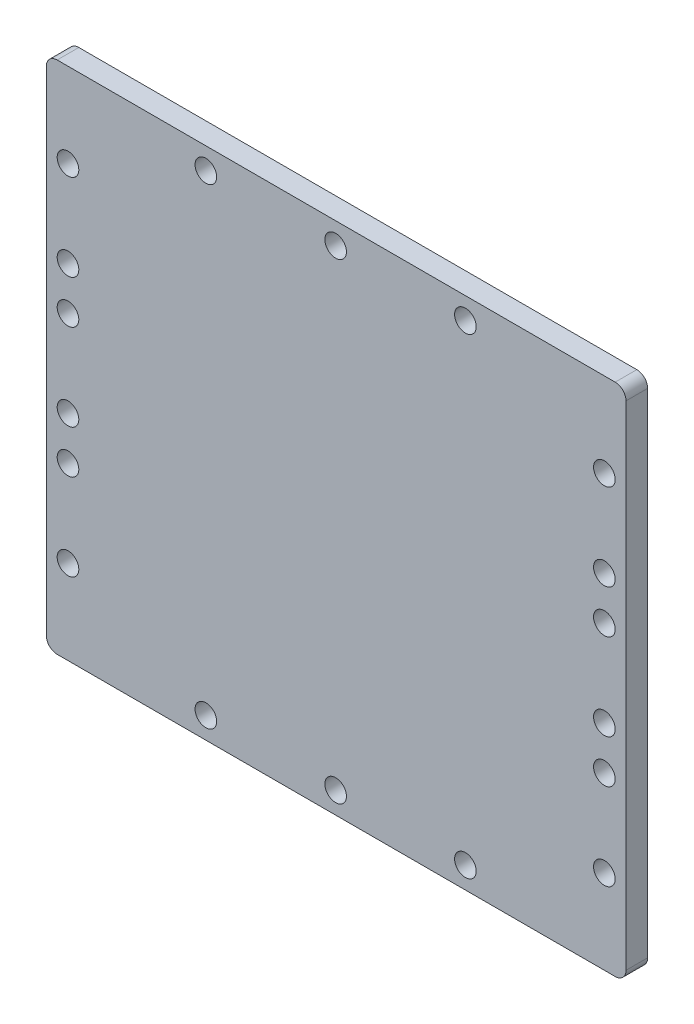
ISO-10303-21;
HEADER;
FILE_DESCRIPTION(('STEP AP214'),'2;1');
FILE_NAME('part.step','',(''),(''),'','','');
FILE_SCHEMA(('AUTOMOTIVE_DESIGN { 1 0 10303 214 1 1 1 1 }'));
ENDSEC;
DATA;
#1=APPLICATION_CONTEXT('core data for automotive mechanical design processes');
#2=APPLICATION_PROTOCOL_DEFINITION('international standard','automotive_design',2000,#1);
#3=PRODUCT_CONTEXT('',#1,'mechanical');
#4=PRODUCT('Part','Part','',(#3));
#5=PRODUCT_RELATED_PRODUCT_CATEGORY('part','',(#4));
#6=PRODUCT_DEFINITION_FORMATION('','',#4);
#7=PRODUCT_DEFINITION_CONTEXT('part definition',#1,'design');
#8=PRODUCT_DEFINITION('design','',#6,#7);
#9=PRODUCT_DEFINITION_SHAPE('','',#8);
#10=(LENGTH_UNIT() NAMED_UNIT(*) SI_UNIT(.MILLI.,.METRE.));
#11=(NAMED_UNIT(*) PLANE_ANGLE_UNIT() SI_UNIT($,.RADIAN.));
#12=(NAMED_UNIT(*) SI_UNIT($,.STERADIAN.) SOLID_ANGLE_UNIT());
#13=UNCERTAINTY_MEASURE_WITH_UNIT(LENGTH_MEASURE(1.E-05),#10,'distance_accuracy_value','');
#14=(GEOMETRIC_REPRESENTATION_CONTEXT(3) GLOBAL_UNCERTAINTY_ASSIGNED_CONTEXT((#13)) GLOBAL_UNIT_ASSIGNED_CONTEXT((#10,
#11,#12)) REPRESENTATION_CONTEXT('',''));
#15=CARTESIAN_POINT('',(0.,0.,0.));
#16=DIRECTION('',(0.,0.,1.));
#17=DIRECTION('',(1.,0.,0.));
#18=AXIS2_PLACEMENT_3D('',#15,#16,#17);
#19=CARTESIAN_POINT('',(-35.2004898971419,-25.775,2.));
#20=DIRECTION('',(0.,0.,1.));
#21=DIRECTION('',(1.,0.,0.));
#22=AXIS2_PLACEMENT_3D('',#19,#20,#21);
#23=PLANE('',#22);
#24=CARTESIAN_POINT('',(-21.4504898971419,-24.775,2.));
#25=DIRECTION('',(0.,0.,1.));
#26=DIRECTION('',(1.,0.,0.));
#27=AXIS2_PLACEMENT_3D('',#24,#25,#26);
#28=CIRCLE('',#27,1.);
#29=CARTESIAN_POINT('',(-20.4504898971419,-24.775,2.));
#30=VERTEX_POINT('',#29);
#31=EDGE_CURVE('E271',#30,#30,#28,.T.);
#32=ORIENTED_EDGE('',*,*,#31,.F.);
#33=EDGE_LOOP('',(#32));
#34=FACE_BOUND('',#33,.T.);
#35=CARTESIAN_POINT('',(-21.4504898971419,18.825,2.));
#36=DIRECTION('',(0.,0.,1.));
#37=DIRECTION('',(1.,0.,0.));
#38=AXIS2_PLACEMENT_3D('',#35,#36,#37);
#39=CIRCLE('',#38,1.);
#40=CARTESIAN_POINT('',(-20.4504898971419,18.825,2.));
#41=VERTEX_POINT('',#40);
#42=EDGE_CURVE('E259',#41,#41,#39,.T.);
#43=ORIENTED_EDGE('',*,*,#42,.F.);
#44=EDGE_LOOP('',(#43));
#45=FACE_BOUND('',#44,.T.);
#46=CARTESIAN_POINT('',(15.3995101028581,-10.975,2.));
#47=DIRECTION('',(0.,0.,1.));
#48=DIRECTION('',(1.,0.,0.));
#49=AXIS2_PLACEMENT_3D('',#46,#47,#48);
#50=CIRCLE('',#49,1.);
#51=CARTESIAN_POINT('',(16.3995101028581,-10.975,2.));
#52=VERTEX_POINT('',#51);
#53=EDGE_CURVE('E247',#52,#52,#50,.T.);
#54=ORIENTED_EDGE('',*,*,#53,.F.);
#55=EDGE_LOOP('',(#54));
#56=FACE_BOUND('',#55,.T.);
#57=CARTESIAN_POINT('',(15.3995101028581,13.025,2.));
#58=DIRECTION('',(0.,0.,1.));
#59=DIRECTION('',(1.,0.,0.));
#60=AXIS2_PLACEMENT_3D('',#57,#58,#59);
#61=CIRCLE('',#60,1.);
#62=CARTESIAN_POINT('',(16.3995101028581,13.025,2.));
#63=VERTEX_POINT('',#62);
#64=EDGE_CURVE('E235',#63,#63,#61,.T.);
#65=ORIENTED_EDGE('',*,*,#64,.F.);
#66=EDGE_LOOP('',(#65));
#67=FACE_BOUND('',#66,.T.);
#68=CARTESIAN_POINT('',(-34.2004898971419,-10.975,2.));
#69=DIRECTION('',(0.,0.,1.));
#70=DIRECTION('',(1.,0.,0.));
#71=AXIS2_PLACEMENT_3D('',#68,#69,#70);
#72=CIRCLE('',#71,0.999999999999998);
#73=CARTESIAN_POINT('',(-33.2004898971419,-10.975,2.));
#74=VERTEX_POINT('',#73);
#75=EDGE_CURVE('E223',#74,#74,#72,.T.);
#76=ORIENTED_EDGE('',*,*,#75,.F.);
#77=EDGE_LOOP('',(#76));
#78=FACE_BOUND('',#77,.T.);
#79=CARTESIAN_POINT('',(15.3995101028581,-6.97499999999999,2.));
#80=DIRECTION('',(0.,0.,1.));
#81=DIRECTION('',(1.,0.,0.));
#82=AXIS2_PLACEMENT_3D('',#79,#80,#81);
#83=CIRCLE('',#82,1.);
#84=CARTESIAN_POINT('',(16.3995101028581,-6.97499999999999,2.));
#85=VERTEX_POINT('',#84);
#86=EDGE_CURVE('E211',#85,#85,#83,.T.);
#87=ORIENTED_EDGE('',*,*,#86,.F.);
#88=EDGE_LOOP('',(#87));
#89=FACE_BOUND('',#88,.T.);
#90=CARTESIAN_POINT('',(-34.2004898971419,1.02500000000001,2.));
#91=DIRECTION('',(0.,0.,1.));
#92=DIRECTION('',(1.,0.,0.));
#93=AXIS2_PLACEMENT_3D('',#90,#91,#92);
#94=CIRCLE('',#93,0.999999999999998);
#95=CARTESIAN_POINT('',(-33.2004898971419,1.02500000000001,2.));
#96=VERTEX_POINT('',#95);
#97=EDGE_CURVE('E199',#96,#96,#94,.T.);
#98=ORIENTED_EDGE('',*,*,#97,.F.);
#99=EDGE_LOOP('',(#98));
#100=FACE_BOUND('',#99,.T.);
#101=CARTESIAN_POINT('',(-34.2004898971419,13.025,2.));
#102=DIRECTION('',(0.,0.,1.));
#103=DIRECTION('',(1.,0.,0.));
#104=AXIS2_PLACEMENT_3D('',#101,#102,#103);
#105=CIRCLE('',#104,0.999999999999998);
#106=CARTESIAN_POINT('',(-33.2004898971419,13.025,2.));
#107=VERTEX_POINT('',#106);
#108=EDGE_CURVE('E187',#107,#107,#105,.T.);
#109=ORIENTED_EDGE('',*,*,#108,.F.);
#110=EDGE_LOOP('',(#109));
#111=FACE_BOUND('',#110,.T.);
#112=CARTESIAN_POINT('',(-9.4504898971419,18.825,2.));
#113=DIRECTION('',(0.,0.,1.));
#114=DIRECTION('',(1.,0.,0.));
#115=AXIS2_PLACEMENT_3D('',#112,#113,#114);
#116=CIRCLE('',#115,1.);
#117=CARTESIAN_POINT('',(-8.4504898971419,18.825,2.));
#118=VERTEX_POINT('',#117);
#119=EDGE_CURVE('E133',#118,#118,#116,.T.);
#120=ORIENTED_EDGE('',*,*,#119,.F.);
#121=EDGE_LOOP('',(#120));
#122=FACE_BOUND('',#121,.T.);
#123=CARTESIAN_POINT('',(-35.2004898971419,-25.775,2.));
#124=DIRECTION('',(0.,0.,1.));
#125=DIRECTION('',(1.,0.,0.));
#126=AXIS2_PLACEMENT_3D('',#123,#124,#125);
#127=CIRCLE('',#126,1.);
#128=CARTESIAN_POINT('',(-36.2004898971419,-25.775,2.));
#129=VERTEX_POINT('',#128);
#130=CARTESIAN_POINT('',(-35.2004898971419,-26.775,2.));
#131=VERTEX_POINT('',#130);
#132=EDGE_CURVE('E144',#129,#131,#127,.T.);
#133=ORIENTED_EDGE('',*,*,#132,.T.);
#134=DIRECTION('',(1.,0.,0.));
#135=VECTOR('',#134,1.);
#136=CARTESIAN_POINT('',(-35.2004898971419,-26.775,2.));
#137=LINE('',#136,#135);
#138=CARTESIAN_POINT('',(16.3995101028581,-26.775,2.));
#139=VERTEX_POINT('',#138);
#140=EDGE_CURVE('E92',#131,#139,#137,.T.);
#141=ORIENTED_EDGE('',*,*,#140,.T.);
#142=CARTESIAN_POINT('',(16.3995101028581,-25.775,2.));
#143=DIRECTION('',(0.,0.,1.));
#144=DIRECTION('',(1.,0.,0.));
#145=AXIS2_PLACEMENT_3D('',#142,#143,#144);
#146=CIRCLE('',#145,1.);
#147=CARTESIAN_POINT('',(17.3995101028581,-25.775,2.));
#148=VERTEX_POINT('',#147);
#149=EDGE_CURVE('E159',#139,#148,#146,.T.);
#150=ORIENTED_EDGE('',*,*,#149,.T.);
#151=DIRECTION('',(0.,1.,0.));
#152=VECTOR('',#151,1.);
#153=CARTESIAN_POINT('',(17.3995101028581,19.825,2.));
#154=LINE('',#153,#152);
#155=CARTESIAN_POINT('',(17.3995101028581,19.825,2.));
#156=VERTEX_POINT('',#155);
#157=EDGE_CURVE('E172',#148,#156,#154,.T.);
#158=ORIENTED_EDGE('',*,*,#157,.T.);
#159=CARTESIAN_POINT('',(16.3995101028581,19.825,2.));
#160=DIRECTION('',(0.,0.,1.));
#161=DIRECTION('',(-1.,0.,0.));
#162=AXIS2_PLACEMENT_3D('',#159,#160,#161);
#163=CIRCLE('',#162,1.);
#164=CARTESIAN_POINT('',(16.3995101028581,20.825,2.));
#165=VERTEX_POINT('',#164);
#166=EDGE_CURVE('E111',#156,#165,#163,.T.);
#167=ORIENTED_EDGE('',*,*,#166,.T.);
#168=DIRECTION('',(-1.,0.,0.));
#169=VECTOR('',#168,1.);
#170=CARTESIAN_POINT('',(-35.2004898971419,20.825,2.));
#171=LINE('',#170,#169);
#172=CARTESIAN_POINT('',(-35.2004898971419,20.825,2.));
#173=VERTEX_POINT('',#172);
#174=EDGE_CURVE('E105',#165,#173,#171,.T.);
#175=ORIENTED_EDGE('',*,*,#174,.T.);
#176=CARTESIAN_POINT('',(-35.2004898971419,19.825,2.));
#177=DIRECTION('',(0.,0.,1.));
#178=DIRECTION('',(1.,0.,0.));
#179=AXIS2_PLACEMENT_3D('',#176,#177,#178);
#180=CIRCLE('',#179,1.);
#181=CARTESIAN_POINT('',(-36.2004898971419,19.825,2.));
#182=VERTEX_POINT('',#181);
#183=EDGE_CURVE('E109',#173,#182,#180,.T.);
#184=ORIENTED_EDGE('',*,*,#183,.T.);
#185=DIRECTION('',(0.,-1.,0.));
#186=VECTOR('',#185,1.);
#187=CARTESIAN_POINT('',(-36.2004898971419,19.825,2.));
#188=LINE('',#187,#186);
#189=EDGE_CURVE('E49',#182,#129,#188,.T.);
#190=ORIENTED_EDGE('',*,*,#189,.T.);
#191=EDGE_LOOP('',(#133,#141,#150,#158,#167,#175,#184,#190));
#192=FACE_BOUND('',#191,.T.);
#193=CARTESIAN_POINT('',(-9.4504898971419,-24.775,2.));
#194=DIRECTION('',(0.,0.,1.));
#195=DIRECTION('',(1.,0.,0.));
#196=AXIS2_PLACEMENT_3D('',#193,#194,#195);
#197=CIRCLE('',#196,1.);
#198=CARTESIAN_POINT('',(-8.4504898971419,-24.775,2.));
#199=VERTEX_POINT('',#198);
#200=EDGE_CURVE('E181',#199,#199,#197,.T.);
#201=ORIENTED_EDGE('',*,*,#200,.F.);
#202=EDGE_LOOP('',(#201));
#203=FACE_BOUND('',#202,.T.);
#204=CARTESIAN_POINT('',(15.3995101028581,1.02500000000001,2.));
#205=DIRECTION('',(0.,0.,1.));
#206=DIRECTION('',(1.,0.,0.));
#207=AXIS2_PLACEMENT_3D('',#204,#205,#206);
#208=CIRCLE('',#207,1.);
#209=CARTESIAN_POINT('',(16.3995101028581,1.02500000000001,2.));
#210=VERTEX_POINT('',#209);
#211=EDGE_CURVE('E193',#210,#210,#208,.T.);
#212=ORIENTED_EDGE('',*,*,#211,.F.);
#213=EDGE_LOOP('',(#212));
#214=FACE_BOUND('',#213,.T.);
#215=CARTESIAN_POINT('',(-34.2004898971419,-6.97499999999999,2.));
#216=DIRECTION('',(0.,0.,1.));
#217=DIRECTION('',(1.,0.,0.));
#218=AXIS2_PLACEMENT_3D('',#215,#216,#217);
#219=CIRCLE('',#218,0.999999999999998);
#220=CARTESIAN_POINT('',(-33.2004898971419,-6.97499999999999,2.));
#221=VERTEX_POINT('',#220);
#222=EDGE_CURVE('E205',#221,#221,#219,.T.);
#223=ORIENTED_EDGE('',*,*,#222,.F.);
#224=EDGE_LOOP('',(#223));
#225=FACE_BOUND('',#224,.T.);
#226=CARTESIAN_POINT('',(-34.2004898971419,5.02500000000001,2.));
#227=DIRECTION('',(0.,0.,1.));
#228=DIRECTION('',(1.,0.,0.));
#229=AXIS2_PLACEMENT_3D('',#226,#227,#228);
#230=CIRCLE('',#229,0.999999999999998);
#231=CARTESIAN_POINT('',(-33.2004898971419,5.02500000000001,2.));
#232=VERTEX_POINT('',#231);
#233=EDGE_CURVE('E217',#232,#232,#230,.T.);
#234=ORIENTED_EDGE('',*,*,#233,.F.);
#235=EDGE_LOOP('',(#234));
#236=FACE_BOUND('',#235,.T.);
#237=CARTESIAN_POINT('',(-34.2004898971419,-18.975,2.));
#238=DIRECTION('',(0.,0.,1.));
#239=DIRECTION('',(1.,0.,0.));
#240=AXIS2_PLACEMENT_3D('',#237,#238,#239);
#241=CIRCLE('',#240,0.999999999999998);
#242=CARTESIAN_POINT('',(-33.2004898971419,-18.975,2.));
#243=VERTEX_POINT('',#242);
#244=EDGE_CURVE('E229',#243,#243,#241,.T.);
#245=ORIENTED_EDGE('',*,*,#244,.F.);
#246=EDGE_LOOP('',(#245));
#247=FACE_BOUND('',#246,.T.);
#248=CARTESIAN_POINT('',(15.3995101028581,5.02500000000001,2.));
#249=DIRECTION('',(0.,0.,1.));
#250=DIRECTION('',(1.,0.,0.));
#251=AXIS2_PLACEMENT_3D('',#248,#249,#250);
#252=CIRCLE('',#251,1.00000000000001);
#253=CARTESIAN_POINT('',(16.3995101028581,5.02500000000001,2.));
#254=VERTEX_POINT('',#253);
#255=EDGE_CURVE('E241',#254,#254,#252,.T.);
#256=ORIENTED_EDGE('',*,*,#255,.F.);
#257=EDGE_LOOP('',(#256));
#258=FACE_BOUND('',#257,.T.);
#259=CARTESIAN_POINT('',(15.3995101028581,-18.975,2.));
#260=DIRECTION('',(0.,0.,1.));
#261=DIRECTION('',(1.,0.,0.));
#262=AXIS2_PLACEMENT_3D('',#259,#260,#261);
#263=CIRCLE('',#262,1.);
#264=CARTESIAN_POINT('',(16.3995101028581,-18.975,2.));
#265=VERTEX_POINT('',#264);
#266=EDGE_CURVE('E253',#265,#265,#263,.T.);
#267=ORIENTED_EDGE('',*,*,#266,.F.);
#268=EDGE_LOOP('',(#267));
#269=FACE_BOUND('',#268,.T.);
#270=CARTESIAN_POINT('',(2.5495101028581,18.825,2.));
#271=DIRECTION('',(0.,0.,1.));
#272=DIRECTION('',(1.,0.,0.));
#273=AXIS2_PLACEMENT_3D('',#270,#271,#272);
#274=CIRCLE('',#273,1.);
#275=CARTESIAN_POINT('',(3.5495101028581,18.825,2.));
#276=VERTEX_POINT('',#275);
#277=EDGE_CURVE('E265',#276,#276,#274,.T.);
#278=ORIENTED_EDGE('',*,*,#277,.F.);
#279=EDGE_LOOP('',(#278));
#280=FACE_BOUND('',#279,.T.);
#281=CARTESIAN_POINT('',(2.54951010285809,-24.775,2.));
#282=DIRECTION('',(0.,0.,1.));
#283=DIRECTION('',(1.,0.,0.));
#284=AXIS2_PLACEMENT_3D('',#281,#282,#283);
#285=CIRCLE('',#284,1.);
#286=CARTESIAN_POINT('',(3.5495101028581,-24.775,2.));
#287=VERTEX_POINT('',#286);
#288=EDGE_CURVE('E277',#287,#287,#285,.T.);
#289=ORIENTED_EDGE('',*,*,#288,.F.);
#290=EDGE_LOOP('',(#289));
#291=FACE_BOUND('',#290,.T.);
#292=ADVANCED_FACE('F32',(#34,#45,#56,#67,#78,#89,#100,#111,#122,#192,#203,#214,#225,#236,#247,
#258,#269,#280,#291),#23,.T.);
#293=CARTESIAN_POINT('',(-35.2004898971419,-25.775,0.));
#294=DIRECTION('',(0.,0.,1.));
#295=DIRECTION('',(1.,0.,0.));
#296=AXIS2_PLACEMENT_3D('',#293,#294,#295);
#297=PLANE('',#296);
#298=CARTESIAN_POINT('',(-35.2004898971419,-25.775,0.));
#299=DIRECTION('',(0.,0.,1.));
#300=DIRECTION('',(1.,0.,0.));
#301=AXIS2_PLACEMENT_3D('',#298,#299,#300);
#302=CIRCLE('',#301,1.);
#303=CARTESIAN_POINT('',(-36.2004898971419,-25.775,0.));
#304=VERTEX_POINT('',#303);
#305=CARTESIAN_POINT('',(-35.2004898971419,-26.775,0.));
#306=VERTEX_POINT('',#305);
#307=EDGE_CURVE('E129',#304,#306,#302,.T.);
#308=ORIENTED_EDGE('',*,*,#307,.F.);
#309=DIRECTION('',(0.,-1.,0.));
#310=VECTOR('',#309,1.);
#311=CARTESIAN_POINT('',(-36.2004898971419,19.825,0.));
#312=LINE('',#311,#310);
#313=CARTESIAN_POINT('',(-36.2004898971419,19.825,0.));
#314=VERTEX_POINT('',#313);
#315=EDGE_CURVE('E84',#314,#304,#312,.T.);
#316=ORIENTED_EDGE('',*,*,#315,.F.);
#317=CARTESIAN_POINT('',(-35.2004898971419,19.825,0.));
#318=DIRECTION('',(0.,0.,1.));
#319=DIRECTION('',(1.,0.,0.));
#320=AXIS2_PLACEMENT_3D('',#317,#318,#319);
#321=CIRCLE('',#320,1.);
#322=CARTESIAN_POINT('',(-35.2004898971419,20.825,0.));
#323=VERTEX_POINT('',#322);
#324=EDGE_CURVE('E78',#323,#314,#321,.T.);
#325=ORIENTED_EDGE('',*,*,#324,.F.);
#326=DIRECTION('',(-1.,0.,0.));
#327=VECTOR('',#326,1.);
#328=CARTESIAN_POINT('',(-35.2004898971419,20.825,0.));
#329=LINE('',#328,#327);
#330=CARTESIAN_POINT('',(16.3995101028581,20.825,0.));
#331=VERTEX_POINT('',#330);
#332=EDGE_CURVE('E119',#331,#323,#329,.T.);
#333=ORIENTED_EDGE('',*,*,#332,.F.);
#334=CARTESIAN_POINT('',(16.3995101028581,19.825,0.));
#335=DIRECTION('',(0.,0.,1.));
#336=DIRECTION('',(-1.,0.,0.));
#337=AXIS2_PLACEMENT_3D('',#334,#335,#336);
#338=CIRCLE('',#337,1.);
#339=CARTESIAN_POINT('',(17.3995101028581,19.825,0.));
#340=VERTEX_POINT('',#339);
#341=EDGE_CURVE('E139',#340,#331,#338,.T.);
#342=ORIENTED_EDGE('',*,*,#341,.F.);
#343=DIRECTION('',(0.,1.,0.));
#344=VECTOR('',#343,1.);
#345=CARTESIAN_POINT('',(17.3995101028581,19.825,0.));
#346=LINE('',#345,#344);
#347=CARTESIAN_POINT('',(17.3995101028581,-25.775,0.));
#348=VERTEX_POINT('',#347);
#349=EDGE_CURVE('E137',#348,#340,#346,.T.);
#350=ORIENTED_EDGE('',*,*,#349,.F.);
#351=CARTESIAN_POINT('',(16.3995101028581,-25.775,0.));
#352=DIRECTION('',(0.,0.,1.));
#353=DIRECTION('',(1.,0.,0.));
#354=AXIS2_PLACEMENT_3D('',#351,#352,#353);
#355=CIRCLE('',#354,1.);
#356=CARTESIAN_POINT('',(16.3995101028581,-26.775,0.));
#357=VERTEX_POINT('',#356);
#358=EDGE_CURVE('E135',#357,#348,#355,.T.);
#359=ORIENTED_EDGE('',*,*,#358,.F.);
#360=DIRECTION('',(1.,0.,0.));
#361=VECTOR('',#360,1.);
#362=CARTESIAN_POINT('',(-35.2004898971419,-26.775,0.));
#363=LINE('',#362,#361);
#364=EDGE_CURVE('E132',#306,#357,#363,.T.);
#365=ORIENTED_EDGE('',*,*,#364,.F.);
#366=EDGE_LOOP('',(#308,#316,#325,#333,#342,#350,#359,#365));
#367=FACE_BOUND('',#366,.T.);
#368=CARTESIAN_POINT('',(-9.4504898971419,18.825,0.));
#369=DIRECTION('',(0.,0.,1.));
#370=DIRECTION('',(1.,0.,0.));
#371=AXIS2_PLACEMENT_3D('',#368,#369,#370);
#372=CIRCLE('',#371,1.);
#373=CARTESIAN_POINT('',(-8.4504898971419,18.825,0.));
#374=VERTEX_POINT('',#373);
#375=EDGE_CURVE('E178',#374,#374,#372,.T.);
#376=ORIENTED_EDGE('',*,*,#375,.T.);
#377=EDGE_LOOP('',(#376));
#378=FACE_BOUND('',#377,.T.);
#379=CARTESIAN_POINT('',(-9.4504898971419,-24.775,0.));
#380=DIRECTION('',(0.,0.,1.));
#381=DIRECTION('',(1.,0.,0.));
#382=AXIS2_PLACEMENT_3D('',#379,#380,#381);
#383=CIRCLE('',#382,1.);
#384=CARTESIAN_POINT('',(-8.4504898971419,-24.775,0.));
#385=VERTEX_POINT('',#384);
#386=EDGE_CURVE('E184',#385,#385,#383,.T.);
#387=ORIENTED_EDGE('',*,*,#386,.T.);
#388=EDGE_LOOP('',(#387));
#389=FACE_BOUND('',#388,.T.);
#390=CARTESIAN_POINT('',(-34.2004898971419,13.025,0.));
#391=DIRECTION('',(0.,0.,1.));
#392=DIRECTION('',(1.,0.,0.));
#393=AXIS2_PLACEMENT_3D('',#390,#391,#392);
#394=CIRCLE('',#393,0.999999999999998);
#395=CARTESIAN_POINT('',(-33.2004898971419,13.025,0.));
#396=VERTEX_POINT('',#395);
#397=EDGE_CURVE('E190',#396,#396,#394,.T.);
#398=ORIENTED_EDGE('',*,*,#397,.T.);
#399=EDGE_LOOP('',(#398));
#400=FACE_BOUND('',#399,.T.);
#401=CARTESIAN_POINT('',(15.3995101028581,1.02500000000001,0.));
#402=DIRECTION('',(0.,0.,1.));
#403=DIRECTION('',(1.,0.,0.));
#404=AXIS2_PLACEMENT_3D('',#401,#402,#403);
#405=CIRCLE('',#404,1.);
#406=CARTESIAN_POINT('',(16.3995101028581,1.02500000000001,0.));
#407=VERTEX_POINT('',#406);
#408=EDGE_CURVE('E196',#407,#407,#405,.T.);
#409=ORIENTED_EDGE('',*,*,#408,.T.);
#410=EDGE_LOOP('',(#409));
#411=FACE_BOUND('',#410,.T.);
#412=CARTESIAN_POINT('',(-34.2004898971419,1.02500000000001,0.));
#413=DIRECTION('',(0.,0.,1.));
#414=DIRECTION('',(1.,0.,0.));
#415=AXIS2_PLACEMENT_3D('',#412,#413,#414);
#416=CIRCLE('',#415,0.999999999999998);
#417=CARTESIAN_POINT('',(-33.2004898971419,1.02500000000001,0.));
#418=VERTEX_POINT('',#417);
#419=EDGE_CURVE('E202',#418,#418,#416,.T.);
#420=ORIENTED_EDGE('',*,*,#419,.T.);
#421=EDGE_LOOP('',(#420));
#422=FACE_BOUND('',#421,.T.);
#423=CARTESIAN_POINT('',(-34.2004898971419,-6.97499999999999,0.));
#424=DIRECTION('',(0.,0.,1.));
#425=DIRECTION('',(1.,0.,0.));
#426=AXIS2_PLACEMENT_3D('',#423,#424,#425);
#427=CIRCLE('',#426,0.999999999999998);
#428=CARTESIAN_POINT('',(-33.2004898971419,-6.97499999999999,0.));
#429=VERTEX_POINT('',#428);
#430=EDGE_CURVE('E208',#429,#429,#427,.T.);
#431=ORIENTED_EDGE('',*,*,#430,.T.);
#432=EDGE_LOOP('',(#431));
#433=FACE_BOUND('',#432,.T.);
#434=CARTESIAN_POINT('',(15.3995101028581,-6.97499999999999,0.));
#435=DIRECTION('',(0.,0.,1.));
#436=DIRECTION('',(1.,0.,0.));
#437=AXIS2_PLACEMENT_3D('',#434,#435,#436);
#438=CIRCLE('',#437,1.);
#439=CARTESIAN_POINT('',(16.3995101028581,-6.97499999999999,0.));
#440=VERTEX_POINT('',#439);
#441=EDGE_CURVE('E214',#440,#440,#438,.T.);
#442=ORIENTED_EDGE('',*,*,#441,.T.);
#443=EDGE_LOOP('',(#442));
#444=FACE_BOUND('',#443,.T.);
#445=CARTESIAN_POINT('',(-34.2004898971419,5.02500000000001,0.));
#446=DIRECTION('',(0.,0.,1.));
#447=DIRECTION('',(1.,0.,0.));
#448=AXIS2_PLACEMENT_3D('',#445,#446,#447);
#449=CIRCLE('',#448,0.999999999999998);
#450=CARTESIAN_POINT('',(-33.2004898971419,5.02500000000001,0.));
#451=VERTEX_POINT('',#450);
#452=EDGE_CURVE('E220',#451,#451,#449,.T.);
#453=ORIENTED_EDGE('',*,*,#452,.T.);
#454=EDGE_LOOP('',(#453));
#455=FACE_BOUND('',#454,.T.);
#456=CARTESIAN_POINT('',(-34.2004898971419,-10.975,0.));
#457=DIRECTION('',(0.,0.,1.));
#458=DIRECTION('',(1.,0.,0.));
#459=AXIS2_PLACEMENT_3D('',#456,#457,#458);
#460=CIRCLE('',#459,0.999999999999998);
#461=CARTESIAN_POINT('',(-33.2004898971419,-10.975,0.));
#462=VERTEX_POINT('',#461);
#463=EDGE_CURVE('E226',#462,#462,#460,.T.);
#464=ORIENTED_EDGE('',*,*,#463,.T.);
#465=EDGE_LOOP('',(#464));
#466=FACE_BOUND('',#465,.T.);
#467=CARTESIAN_POINT('',(-34.2004898971419,-18.975,0.));
#468=DIRECTION('',(0.,0.,1.));
#469=DIRECTION('',(1.,0.,0.));
#470=AXIS2_PLACEMENT_3D('',#467,#468,#469);
#471=CIRCLE('',#470,0.999999999999998);
#472=CARTESIAN_POINT('',(-33.2004898971419,-18.975,0.));
#473=VERTEX_POINT('',#472);
#474=EDGE_CURVE('E232',#473,#473,#471,.T.);
#475=ORIENTED_EDGE('',*,*,#474,.T.);
#476=EDGE_LOOP('',(#475));
#477=FACE_BOUND('',#476,.T.);
#478=CARTESIAN_POINT('',(15.3995101028581,13.025,0.));
#479=DIRECTION('',(0.,0.,1.));
#480=DIRECTION('',(1.,0.,0.));
#481=AXIS2_PLACEMENT_3D('',#478,#479,#480);
#482=CIRCLE('',#481,1.);
#483=CARTESIAN_POINT('',(16.3995101028581,13.025,0.));
#484=VERTEX_POINT('',#483);
#485=EDGE_CURVE('E238',#484,#484,#482,.T.);
#486=ORIENTED_EDGE('',*,*,#485,.T.);
#487=EDGE_LOOP('',(#486));
#488=FACE_BOUND('',#487,.T.);
#489=CARTESIAN_POINT('',(15.3995101028581,5.02500000000001,0.));
#490=DIRECTION('',(0.,0.,1.));
#491=DIRECTION('',(1.,0.,0.));
#492=AXIS2_PLACEMENT_3D('',#489,#490,#491);
#493=CIRCLE('',#492,1.00000000000001);
#494=CARTESIAN_POINT('',(16.3995101028581,5.02500000000001,0.));
#495=VERTEX_POINT('',#494);
#496=EDGE_CURVE('E244',#495,#495,#493,.T.);
#497=ORIENTED_EDGE('',*,*,#496,.T.);
#498=EDGE_LOOP('',(#497));
#499=FACE_BOUND('',#498,.T.);
#500=CARTESIAN_POINT('',(15.3995101028581,-10.975,0.));
#501=DIRECTION('',(0.,0.,1.));
#502=DIRECTION('',(1.,0.,0.));
#503=AXIS2_PLACEMENT_3D('',#500,#501,#502);
#504=CIRCLE('',#503,1.);
#505=CARTESIAN_POINT('',(16.3995101028581,-10.975,0.));
#506=VERTEX_POINT('',#505);
#507=EDGE_CURVE('E250',#506,#506,#504,.T.);
#508=ORIENTED_EDGE('',*,*,#507,.T.);
#509=EDGE_LOOP('',(#508));
#510=FACE_BOUND('',#509,.T.);
#511=CARTESIAN_POINT('',(15.3995101028581,-18.975,0.));
#512=DIRECTION('',(0.,0.,1.));
#513=DIRECTION('',(1.,0.,0.));
#514=AXIS2_PLACEMENT_3D('',#511,#512,#513);
#515=CIRCLE('',#514,1.);
#516=CARTESIAN_POINT('',(16.3995101028581,-18.975,0.));
#517=VERTEX_POINT('',#516);
#518=EDGE_CURVE('E256',#517,#517,#515,.T.);
#519=ORIENTED_EDGE('',*,*,#518,.T.);
#520=EDGE_LOOP('',(#519));
#521=FACE_BOUND('',#520,.T.);
#522=CARTESIAN_POINT('',(-21.4504898971419,18.825,0.));
#523=DIRECTION('',(0.,0.,1.));
#524=DIRECTION('',(1.,0.,0.));
#525=AXIS2_PLACEMENT_3D('',#522,#523,#524);
#526=CIRCLE('',#525,1.);
#527=CARTESIAN_POINT('',(-20.4504898971419,18.825,0.));
#528=VERTEX_POINT('',#527);
#529=EDGE_CURVE('E262',#528,#528,#526,.T.);
#530=ORIENTED_EDGE('',*,*,#529,.T.);
#531=EDGE_LOOP('',(#530));
#532=FACE_BOUND('',#531,.T.);
#533=CARTESIAN_POINT('',(2.5495101028581,18.825,0.));
#534=DIRECTION('',(0.,0.,1.));
#535=DIRECTION('',(1.,0.,0.));
#536=AXIS2_PLACEMENT_3D('',#533,#534,#535);
#537=CIRCLE('',#536,1.);
#538=CARTESIAN_POINT('',(3.5495101028581,18.825,0.));
#539=VERTEX_POINT('',#538);
#540=EDGE_CURVE('E268',#539,#539,#537,.T.);
#541=ORIENTED_EDGE('',*,*,#540,.T.);
#542=EDGE_LOOP('',(#541));
#543=FACE_BOUND('',#542,.T.);
#544=CARTESIAN_POINT('',(-21.4504898971419,-24.775,0.));
#545=DIRECTION('',(0.,0.,1.));
#546=DIRECTION('',(1.,0.,0.));
#547=AXIS2_PLACEMENT_3D('',#544,#545,#546);
#548=CIRCLE('',#547,1.);
#549=CARTESIAN_POINT('',(-20.4504898971419,-24.775,0.));
#550=VERTEX_POINT('',#549);
#551=EDGE_CURVE('E274',#550,#550,#548,.T.);
#552=ORIENTED_EDGE('',*,*,#551,.T.);
#553=EDGE_LOOP('',(#552));
#554=FACE_BOUND('',#553,.T.);
#555=CARTESIAN_POINT('',(2.54951010285809,-24.775,0.));
#556=DIRECTION('',(0.,0.,1.));
#557=DIRECTION('',(1.,0.,0.));
#558=AXIS2_PLACEMENT_3D('',#555,#556,#557);
#559=CIRCLE('',#558,1.);
#560=CARTESIAN_POINT('',(3.5495101028581,-24.775,0.));
#561=VERTEX_POINT('',#560);
#562=EDGE_CURVE('E280',#561,#561,#559,.T.);
#563=ORIENTED_EDGE('',*,*,#562,.T.);
#564=EDGE_LOOP('',(#563));
#565=FACE_BOUND('',#564,.T.);
#566=ADVANCED_FACE('F163',(#367,#378,#389,#400,#411,#422,#433,#444,#455,#466,#477,#488,#499,
#510,#521,#532,#543,#554,#565),#297,.F.);
#567=CARTESIAN_POINT('',(-35.2004898971419,-25.775,2.));
#568=DIRECTION('',(0.,0.,-1.));
#569=DIRECTION('',(-1.,0.,0.));
#570=AXIS2_PLACEMENT_3D('',#567,#568,#569);
#571=CYLINDRICAL_SURFACE('',#570,1.);
#572=ORIENTED_EDGE('',*,*,#307,.T.);
#573=DIRECTION('',(0.,0.,-1.));
#574=VECTOR('',#573,1.);
#575=CARTESIAN_POINT('',(-35.2004898971419,-26.775,2.));
#576=LINE('',#575,#574);
#577=EDGE_CURVE('E11',#131,#306,#576,.T.);
#578=ORIENTED_EDGE('',*,*,#577,.F.);
#579=ORIENTED_EDGE('',*,*,#132,.F.);
#580=DIRECTION('',(0.,0.,-1.));
#581=VECTOR('',#580,1.);
#582=CARTESIAN_POINT('',(-36.2004898971419,-25.775,2.));
#583=LINE('',#582,#581);
#584=EDGE_CURVE('E125',#129,#304,#583,.T.);
#585=ORIENTED_EDGE('',*,*,#584,.T.);
#586=EDGE_LOOP('',(#572,#578,#579,#585));
#587=FACE_BOUND('',#586,.T.);
#588=ADVANCED_FACE('F34',(#587),#571,.T.);
#589=CARTESIAN_POINT('',(-35.2004898971419,-26.775,2.));
#590=DIRECTION('',(0.,1.,0.));
#591=DIRECTION('',(0.,0.,1.));
#592=AXIS2_PLACEMENT_3D('',#589,#590,#591);
#593=PLANE('',#592);
#594=ORIENTED_EDGE('',*,*,#364,.T.);
#595=DIRECTION('',(0.,0.,-1.));
#596=VECTOR('',#595,1.);
#597=CARTESIAN_POINT('',(16.3995101028581,-26.775,2.));
#598=LINE('',#597,#596);
#599=EDGE_CURVE('E41',#139,#357,#598,.T.);
#600=ORIENTED_EDGE('',*,*,#599,.F.);
#601=ORIENTED_EDGE('',*,*,#140,.F.);
#602=ORIENTED_EDGE('',*,*,#577,.T.);
#603=EDGE_LOOP('',(#594,#600,#601,#602));
#604=FACE_BOUND('',#603,.T.);
#605=ADVANCED_FACE('F314',(#604),#593,.F.);
#606=CARTESIAN_POINT('',(16.3995101028581,-25.775,2.));
#607=DIRECTION('',(0.,0.,-1.));
#608=DIRECTION('',(-1.,0.,0.));
#609=AXIS2_PLACEMENT_3D('',#606,#607,#608);
#610=CYLINDRICAL_SURFACE('',#609,1.);
#611=ORIENTED_EDGE('',*,*,#358,.T.);
#612=DIRECTION('',(0.,0.,-1.));
#613=VECTOR('',#612,1.);
#614=CARTESIAN_POINT('',(17.3995101028581,-25.775,2.));
#615=LINE('',#614,#613);
#616=EDGE_CURVE('E151',#148,#348,#615,.T.);
#617=ORIENTED_EDGE('',*,*,#616,.F.);
#618=ORIENTED_EDGE('',*,*,#149,.F.);
#619=ORIENTED_EDGE('',*,*,#599,.T.);
#620=EDGE_LOOP('',(#611,#617,#618,#619));
#621=FACE_BOUND('',#620,.T.);
#622=ADVANCED_FACE('F157',(#621),#610,.T.);
#623=CARTESIAN_POINT('',(17.3995101028581,19.825,2.));
#624=DIRECTION('',(-1.,0.,0.));
#625=DIRECTION('',(0.,-1.,0.));
#626=AXIS2_PLACEMENT_3D('',#623,#624,#625);
#627=PLANE('',#626);
#628=ORIENTED_EDGE('',*,*,#349,.T.);
#629=DIRECTION('',(0.,0.,-1.));
#630=VECTOR('',#629,1.);
#631=CARTESIAN_POINT('',(17.3995101028581,19.825,2.));
#632=LINE('',#631,#630);
#633=EDGE_CURVE('E148',#156,#340,#632,.T.);
#634=ORIENTED_EDGE('',*,*,#633,.F.);
#635=ORIENTED_EDGE('',*,*,#157,.F.);
#636=ORIENTED_EDGE('',*,*,#616,.T.);
#637=EDGE_LOOP('',(#628,#634,#635,#636));
#638=FACE_BOUND('',#637,.T.);
#639=ADVANCED_FACE('F168',(#638),#627,.F.);
#640=CARTESIAN_POINT('',(16.3995101028581,19.825,2.));
#641=DIRECTION('',(0.,0.,-1.));
#642=DIRECTION('',(-1.,0.,0.));
#643=AXIS2_PLACEMENT_3D('',#640,#641,#642);
#644=CYLINDRICAL_SURFACE('',#643,1.);
#645=ORIENTED_EDGE('',*,*,#341,.T.);
#646=DIRECTION('',(0.,0.,-1.));
#647=VECTOR('',#646,1.);
#648=CARTESIAN_POINT('',(16.3995101028581,20.825,2.));
#649=LINE('',#648,#647);
#650=EDGE_CURVE('E120',#165,#331,#649,.T.);
#651=ORIENTED_EDGE('',*,*,#650,.F.);
#652=ORIENTED_EDGE('',*,*,#166,.F.);
#653=ORIENTED_EDGE('',*,*,#633,.T.);
#654=EDGE_LOOP('',(#645,#651,#652,#653));
#655=FACE_BOUND('',#654,.T.);
#656=ADVANCED_FACE('F171',(#655),#644,.T.);
#657=CARTESIAN_POINT('',(-35.2004898971419,20.825,2.));
#658=DIRECTION('',(0.,-1.,0.));
#659=DIRECTION('',(0.,0.,-1.));
#660=AXIS2_PLACEMENT_3D('',#657,#658,#659);
#661=PLANE('',#660);
#662=ORIENTED_EDGE('',*,*,#332,.T.);
#663=DIRECTION('',(0.,0.,-1.));
#664=VECTOR('',#663,1.);
#665=CARTESIAN_POINT('',(-35.2004898971419,20.825,2.));
#666=LINE('',#665,#664);
#667=EDGE_CURVE('E116',#173,#323,#666,.T.);
#668=ORIENTED_EDGE('',*,*,#667,.F.);
#669=ORIENTED_EDGE('',*,*,#174,.F.);
#670=ORIENTED_EDGE('',*,*,#650,.T.);
#671=EDGE_LOOP('',(#662,#668,#669,#670));
#672=FACE_BOUND('',#671,.T.);
#673=ADVANCED_FACE('F117',(#672),#661,.F.);
#674=CARTESIAN_POINT('',(-35.2004898971419,19.825,2.));
#675=DIRECTION('',(0.,0.,-1.));
#676=DIRECTION('',(-1.,0.,0.));
#677=AXIS2_PLACEMENT_3D('',#674,#675,#676);
#678=CYLINDRICAL_SURFACE('',#677,1.);
#679=ORIENTED_EDGE('',*,*,#324,.T.);
#680=DIRECTION('',(0.,0.,-1.));
#681=VECTOR('',#680,1.);
#682=CARTESIAN_POINT('',(-36.2004898971419,19.825,2.));
#683=LINE('',#682,#681);
#684=EDGE_CURVE('E121',#182,#314,#683,.T.);
#685=ORIENTED_EDGE('',*,*,#684,.F.);
#686=ORIENTED_EDGE('',*,*,#183,.F.);
#687=ORIENTED_EDGE('',*,*,#667,.T.);
#688=EDGE_LOOP('',(#679,#685,#686,#687));
#689=FACE_BOUND('',#688,.T.);
#690=ADVANCED_FACE('F123',(#689),#678,.T.);
#691=CARTESIAN_POINT('',(-36.2004898971419,19.825,2.));
#692=DIRECTION('',(1.,0.,0.));
#693=DIRECTION('',(0.,0.,-1.));
#694=AXIS2_PLACEMENT_3D('',#691,#692,#693);
#695=PLANE('',#694);
#696=ORIENTED_EDGE('',*,*,#315,.T.);
#697=ORIENTED_EDGE('',*,*,#584,.F.);
#698=ORIENTED_EDGE('',*,*,#189,.F.);
#699=ORIENTED_EDGE('',*,*,#684,.T.);
#700=EDGE_LOOP('',(#696,#697,#698,#699));
#701=FACE_BOUND('',#700,.T.);
#702=ADVANCED_FACE('F302',(#701),#695,.F.);
#703=CARTESIAN_POINT('',(-9.4504898971419,18.825,2.));
#704=DIRECTION('',(0.,0.,-1.));
#705=DIRECTION('',(-1.,0.,0.));
#706=AXIS2_PLACEMENT_3D('',#703,#704,#705);
#707=CYLINDRICAL_SURFACE('',#706,1.);
#708=ORIENTED_EDGE('',*,*,#119,.T.);
#709=EDGE_LOOP('',(#708));
#710=FACE_BOUND('',#709,.T.);
#711=ORIENTED_EDGE('',*,*,#375,.F.);
#712=EDGE_LOOP('',(#711));
#713=FACE_BOUND('',#712,.T.);
#714=ADVANCED_FACE('F299',(#710,#713),#707,.F.);
#715=CARTESIAN_POINT('',(-9.4504898971419,-24.775,2.));
#716=DIRECTION('',(0.,0.,-1.));
#717=DIRECTION('',(-1.,0.,0.));
#718=AXIS2_PLACEMENT_3D('',#715,#716,#717);
#719=CYLINDRICAL_SURFACE('',#718,1.);
#720=ORIENTED_EDGE('',*,*,#200,.T.);
#721=EDGE_LOOP('',(#720));
#722=FACE_BOUND('',#721,.T.);
#723=ORIENTED_EDGE('',*,*,#386,.F.);
#724=EDGE_LOOP('',(#723));
#725=FACE_BOUND('',#724,.T.);
#726=ADVANCED_FACE('F378',(#722,#725),#719,.F.);
#727=CARTESIAN_POINT('',(-34.2004898971419,13.025,2.));
#728=DIRECTION('',(0.,0.,-1.));
#729=DIRECTION('',(-1.,0.,0.));
#730=AXIS2_PLACEMENT_3D('',#727,#728,#729);
#731=CYLINDRICAL_SURFACE('',#730,0.999999999999998);
#732=ORIENTED_EDGE('',*,*,#108,.T.);
#733=EDGE_LOOP('',(#732));
#734=FACE_BOUND('',#733,.T.);
#735=ORIENTED_EDGE('',*,*,#397,.F.);
#736=EDGE_LOOP('',(#735));
#737=FACE_BOUND('',#736,.T.);
#738=ADVANCED_FACE('F386',(#734,#737),#731,.F.);
#739=CARTESIAN_POINT('',(15.3995101028581,1.02500000000001,2.));
#740=DIRECTION('',(0.,0.,-1.));
#741=DIRECTION('',(-1.,0.,0.));
#742=AXIS2_PLACEMENT_3D('',#739,#740,#741);
#743=CYLINDRICAL_SURFACE('',#742,1.);
#744=ORIENTED_EDGE('',*,*,#211,.T.);
#745=EDGE_LOOP('',(#744));
#746=FACE_BOUND('',#745,.T.);
#747=ORIENTED_EDGE('',*,*,#408,.F.);
#748=EDGE_LOOP('',(#747));
#749=FACE_BOUND('',#748,.T.);
#750=ADVANCED_FACE('F394',(#746,#749),#743,.F.);
#751=CARTESIAN_POINT('',(-34.2004898971419,1.02500000000001,2.));
#752=DIRECTION('',(0.,0.,-1.));
#753=DIRECTION('',(-1.,0.,0.));
#754=AXIS2_PLACEMENT_3D('',#751,#752,#753);
#755=CYLINDRICAL_SURFACE('',#754,0.999999999999998);
#756=ORIENTED_EDGE('',*,*,#97,.T.);
#757=EDGE_LOOP('',(#756));
#758=FACE_BOUND('',#757,.T.);
#759=ORIENTED_EDGE('',*,*,#419,.F.);
#760=EDGE_LOOP('',(#759));
#761=FACE_BOUND('',#760,.T.);
#762=ADVANCED_FACE('F403',(#758,#761),#755,.F.);
#763=CARTESIAN_POINT('',(-34.2004898971419,-6.97499999999999,2.));
#764=DIRECTION('',(0.,0.,-1.));
#765=DIRECTION('',(-1.,0.,0.));
#766=AXIS2_PLACEMENT_3D('',#763,#764,#765);
#767=CYLINDRICAL_SURFACE('',#766,0.999999999999998);
#768=ORIENTED_EDGE('',*,*,#222,.T.);
#769=EDGE_LOOP('',(#768));
#770=FACE_BOUND('',#769,.T.);
#771=ORIENTED_EDGE('',*,*,#430,.F.);
#772=EDGE_LOOP('',(#771));
#773=FACE_BOUND('',#772,.T.);
#774=ADVANCED_FACE('F412',(#770,#773),#767,.F.);
#775=CARTESIAN_POINT('',(15.3995101028581,-6.97499999999999,2.));
#776=DIRECTION('',(0.,0.,-1.));
#777=DIRECTION('',(-1.,0.,0.));
#778=AXIS2_PLACEMENT_3D('',#775,#776,#777);
#779=CYLINDRICAL_SURFACE('',#778,1.);
#780=ORIENTED_EDGE('',*,*,#86,.T.);
#781=EDGE_LOOP('',(#780));
#782=FACE_BOUND('',#781,.T.);
#783=ORIENTED_EDGE('',*,*,#441,.F.);
#784=EDGE_LOOP('',(#783));
#785=FACE_BOUND('',#784,.T.);
#786=ADVANCED_FACE('F421',(#782,#785),#779,.F.);
#787=CARTESIAN_POINT('',(-34.2004898971419,5.02500000000001,2.));
#788=DIRECTION('',(0.,0.,-1.));
#789=DIRECTION('',(-1.,0.,0.));
#790=AXIS2_PLACEMENT_3D('',#787,#788,#789);
#791=CYLINDRICAL_SURFACE('',#790,0.999999999999998);
#792=ORIENTED_EDGE('',*,*,#233,.T.);
#793=EDGE_LOOP('',(#792));
#794=FACE_BOUND('',#793,.T.);
#795=ORIENTED_EDGE('',*,*,#452,.F.);
#796=EDGE_LOOP('',(#795));
#797=FACE_BOUND('',#796,.T.);
#798=ADVANCED_FACE('F430',(#794,#797),#791,.F.);
#799=CARTESIAN_POINT('',(-34.2004898971419,-10.975,2.));
#800=DIRECTION('',(0.,0.,-1.));
#801=DIRECTION('',(-1.,0.,0.));
#802=AXIS2_PLACEMENT_3D('',#799,#800,#801);
#803=CYLINDRICAL_SURFACE('',#802,0.999999999999998);
#804=ORIENTED_EDGE('',*,*,#75,.T.);
#805=EDGE_LOOP('',(#804));
#806=FACE_BOUND('',#805,.T.);
#807=ORIENTED_EDGE('',*,*,#463,.F.);
#808=EDGE_LOOP('',(#807));
#809=FACE_BOUND('',#808,.T.);
#810=ADVANCED_FACE('F439',(#806,#809),#803,.F.);
#811=CARTESIAN_POINT('',(-34.2004898971419,-18.975,2.));
#812=DIRECTION('',(0.,0.,-1.));
#813=DIRECTION('',(-1.,0.,0.));
#814=AXIS2_PLACEMENT_3D('',#811,#812,#813);
#815=CYLINDRICAL_SURFACE('',#814,0.999999999999998);
#816=ORIENTED_EDGE('',*,*,#244,.T.);
#817=EDGE_LOOP('',(#816));
#818=FACE_BOUND('',#817,.T.);
#819=ORIENTED_EDGE('',*,*,#474,.F.);
#820=EDGE_LOOP('',(#819));
#821=FACE_BOUND('',#820,.T.);
#822=ADVANCED_FACE('F448',(#818,#821),#815,.F.);
#823=CARTESIAN_POINT('',(15.3995101028581,13.025,2.));
#824=DIRECTION('',(0.,0.,-1.));
#825=DIRECTION('',(-1.,0.,0.));
#826=AXIS2_PLACEMENT_3D('',#823,#824,#825);
#827=CYLINDRICAL_SURFACE('',#826,1.);
#828=ORIENTED_EDGE('',*,*,#64,.T.);
#829=EDGE_LOOP('',(#828));
#830=FACE_BOUND('',#829,.T.);
#831=ORIENTED_EDGE('',*,*,#485,.F.);
#832=EDGE_LOOP('',(#831));
#833=FACE_BOUND('',#832,.T.);
#834=ADVANCED_FACE('F457',(#830,#833),#827,.F.);
#835=CARTESIAN_POINT('',(15.3995101028581,5.02500000000001,2.));
#836=DIRECTION('',(0.,0.,-1.));
#837=DIRECTION('',(-1.,0.,0.));
#838=AXIS2_PLACEMENT_3D('',#835,#836,#837);
#839=CYLINDRICAL_SURFACE('',#838,1.00000000000001);
#840=ORIENTED_EDGE('',*,*,#255,.T.);
#841=EDGE_LOOP('',(#840));
#842=FACE_BOUND('',#841,.T.);
#843=ORIENTED_EDGE('',*,*,#496,.F.);
#844=EDGE_LOOP('',(#843));
#845=FACE_BOUND('',#844,.T.);
#846=ADVANCED_FACE('F466',(#842,#845),#839,.F.);
#847=CARTESIAN_POINT('',(15.3995101028581,-10.975,2.));
#848=DIRECTION('',(0.,0.,-1.));
#849=DIRECTION('',(-1.,0.,0.));
#850=AXIS2_PLACEMENT_3D('',#847,#848,#849);
#851=CYLINDRICAL_SURFACE('',#850,1.);
#852=ORIENTED_EDGE('',*,*,#53,.T.);
#853=EDGE_LOOP('',(#852));
#854=FACE_BOUND('',#853,.T.);
#855=ORIENTED_EDGE('',*,*,#507,.F.);
#856=EDGE_LOOP('',(#855));
#857=FACE_BOUND('',#856,.T.);
#858=ADVANCED_FACE('F475',(#854,#857),#851,.F.);
#859=CARTESIAN_POINT('',(15.3995101028581,-18.975,2.));
#860=DIRECTION('',(0.,0.,-1.));
#861=DIRECTION('',(-1.,0.,0.));
#862=AXIS2_PLACEMENT_3D('',#859,#860,#861);
#863=CYLINDRICAL_SURFACE('',#862,1.);
#864=ORIENTED_EDGE('',*,*,#266,.T.);
#865=EDGE_LOOP('',(#864));
#866=FACE_BOUND('',#865,.T.);
#867=ORIENTED_EDGE('',*,*,#518,.F.);
#868=EDGE_LOOP('',(#867));
#869=FACE_BOUND('',#868,.T.);
#870=ADVANCED_FACE('F484',(#866,#869),#863,.F.);
#871=CARTESIAN_POINT('',(-21.4504898971419,18.825,2.));
#872=DIRECTION('',(0.,0.,-1.));
#873=DIRECTION('',(-1.,0.,0.));
#874=AXIS2_PLACEMENT_3D('',#871,#872,#873);
#875=CYLINDRICAL_SURFACE('',#874,1.);
#876=ORIENTED_EDGE('',*,*,#42,.T.);
#877=EDGE_LOOP('',(#876));
#878=FACE_BOUND('',#877,.T.);
#879=ORIENTED_EDGE('',*,*,#529,.F.);
#880=EDGE_LOOP('',(#879));
#881=FACE_BOUND('',#880,.T.);
#882=ADVANCED_FACE('F493',(#878,#881),#875,.F.);
#883=CARTESIAN_POINT('',(2.5495101028581,18.825,2.));
#884=DIRECTION('',(0.,0.,-1.));
#885=DIRECTION('',(-1.,0.,0.));
#886=AXIS2_PLACEMENT_3D('',#883,#884,#885);
#887=CYLINDRICAL_SURFACE('',#886,1.);
#888=ORIENTED_EDGE('',*,*,#277,.T.);
#889=EDGE_LOOP('',(#888));
#890=FACE_BOUND('',#889,.T.);
#891=ORIENTED_EDGE('',*,*,#540,.F.);
#892=EDGE_LOOP('',(#891));
#893=FACE_BOUND('',#892,.T.);
#894=ADVANCED_FACE('F502',(#890,#893),#887,.F.);
#895=CARTESIAN_POINT('',(-21.4504898971419,-24.775,2.));
#896=DIRECTION('',(0.,0.,-1.));
#897=DIRECTION('',(-1.,0.,0.));
#898=AXIS2_PLACEMENT_3D('',#895,#896,#897);
#899=CYLINDRICAL_SURFACE('',#898,1.);
#900=ORIENTED_EDGE('',*,*,#31,.T.);
#901=EDGE_LOOP('',(#900));
#902=FACE_BOUND('',#901,.T.);
#903=ORIENTED_EDGE('',*,*,#551,.F.);
#904=EDGE_LOOP('',(#903));
#905=FACE_BOUND('',#904,.T.);
#906=ADVANCED_FACE('F511',(#902,#905),#899,.F.);
#907=CARTESIAN_POINT('',(2.54951010285809,-24.775,2.));
#908=DIRECTION('',(0.,0.,-1.));
#909=DIRECTION('',(-1.,0.,0.));
#910=AXIS2_PLACEMENT_3D('',#907,#908,#909);
#911=CYLINDRICAL_SURFACE('',#910,1.);
#912=ORIENTED_EDGE('',*,*,#288,.T.);
#913=EDGE_LOOP('',(#912));
#914=FACE_BOUND('',#913,.T.);
#915=ORIENTED_EDGE('',*,*,#562,.F.);
#916=EDGE_LOOP('',(#915));
#917=FACE_BOUND('',#916,.T.);
#918=ADVANCED_FACE('F286',(#914,#917),#911,.F.);
#919=CLOSED_SHELL('',(#292,#566,#588,#605,#622,#639,#656,#673,#690,#702,#714,#726,#738,#750,
#762,#774,#786,#798,#810,#822,#834,#846,#858,#870,#882,#894,#906,#918));
#920=MANIFOLD_SOLID_BREP('B2',#919);
#921=ADVANCED_BREP_SHAPE_REPRESENTATION('',(#18,#920),#14);
#922=SHAPE_DEFINITION_REPRESENTATION(#9,#921);
ENDSEC;
END-ISO-10303-21;
